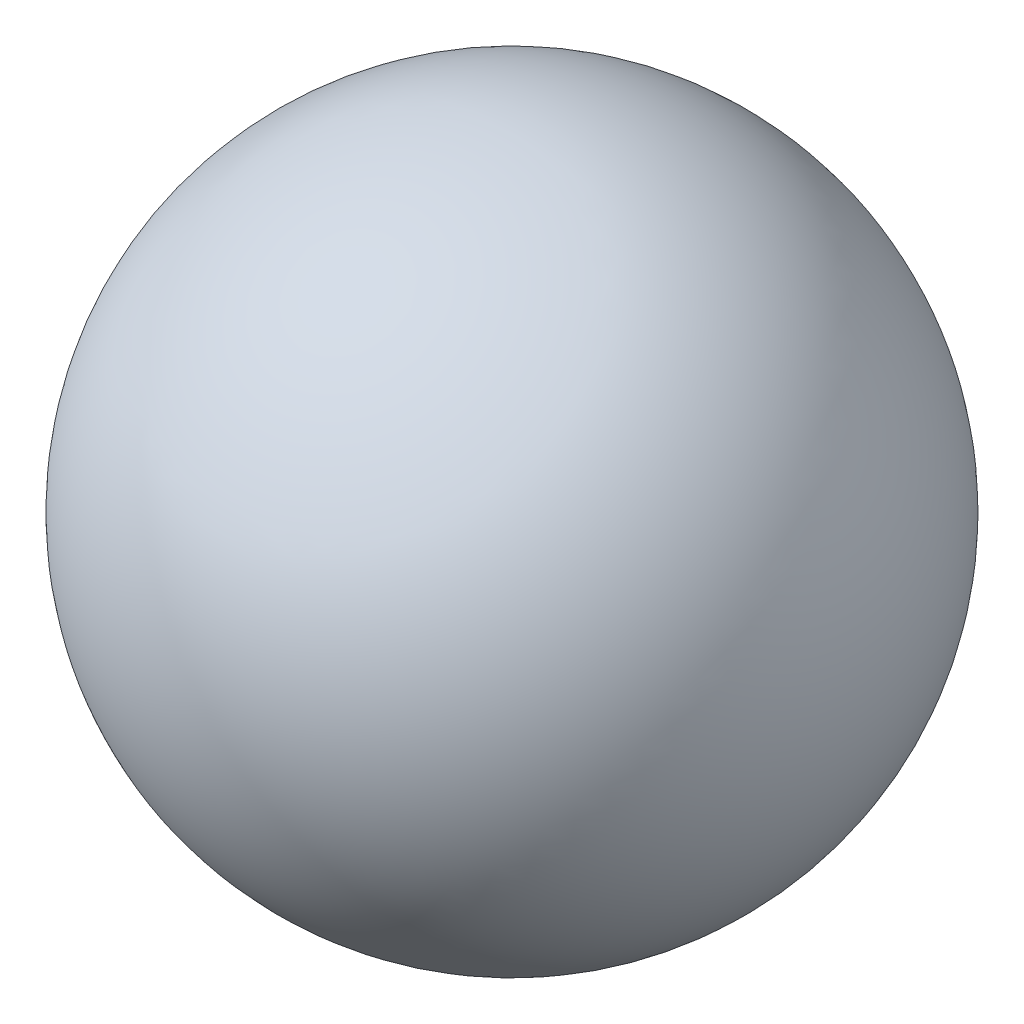
ISO-10303-21;
HEADER;
FILE_DESCRIPTION(('STEP AP214'),'2;1');
FILE_NAME('part.step','',(''),(''),'','','');
FILE_SCHEMA(('AUTOMOTIVE_DESIGN { 1 0 10303 214 1 1 1 1 }'));
ENDSEC;
DATA;
#1=APPLICATION_CONTEXT('core data for automotive mechanical design processes');
#2=APPLICATION_PROTOCOL_DEFINITION('international standard','automotive_design',2000,#1);
#3=PRODUCT_CONTEXT('',#1,'mechanical');
#4=PRODUCT('Part','Part','',(#3));
#5=PRODUCT_RELATED_PRODUCT_CATEGORY('part','',(#4));
#6=PRODUCT_DEFINITION_FORMATION('','',#4);
#7=PRODUCT_DEFINITION_CONTEXT('part definition',#1,'design');
#8=PRODUCT_DEFINITION('design','',#6,#7);
#9=PRODUCT_DEFINITION_SHAPE('','',#8);
#10=(LENGTH_UNIT() NAMED_UNIT(*) SI_UNIT(.MILLI.,.METRE.));
#11=(NAMED_UNIT(*) PLANE_ANGLE_UNIT() SI_UNIT($,.RADIAN.));
#12=(NAMED_UNIT(*) SI_UNIT($,.STERADIAN.) SOLID_ANGLE_UNIT());
#13=UNCERTAINTY_MEASURE_WITH_UNIT(LENGTH_MEASURE(1.E-05),#10,'distance_accuracy_value','');
#14=(GEOMETRIC_REPRESENTATION_CONTEXT(3) GLOBAL_UNCERTAINTY_ASSIGNED_CONTEXT((#13)) GLOBAL_UNIT_ASSIGNED_CONTEXT((#10,
#11,#12)) REPRESENTATION_CONTEXT('',''));
#15=CARTESIAN_POINT('',(0.,0.,0.));
#16=DIRECTION('',(0.,0.,1.));
#17=DIRECTION('',(1.,0.,0.));
#18=AXIS2_PLACEMENT_3D('',#15,#16,#17);
#19=CARTESIAN_POINT('',(0.,0.,-4.));
#20=DIRECTION('',(0.,0.,-1.));
#21=DIRECTION('',(-1.,0.,0.));
#22=AXIS2_PLACEMENT_3D('',#19,#20,#21);
#23=SPHERICAL_SURFACE('',#22,4.);
#24=CARTESIAN_POINT('',(0.,0.,-7.5));
#25=DIRECTION('',(0.,0.,-1.));
#26=DIRECTION('',(-1.,0.,0.));
#27=AXIS2_PLACEMENT_3D('',#24,#25,#26);
#28=CIRCLE('',#27,1.93649167310371);
#29=CARTESIAN_POINT('',(-1.93649167310371,0.,-7.5));
#30=VERTEX_POINT('',#29);
#31=EDGE_CURVE('E13',#30,#30,#28,.T.);
#32=ORIENTED_EDGE('',*,*,#31,.F.);
#33=EDGE_LOOP('',(#32));
#34=FACE_BOUND('',#33,.T.);
#35=ADVANCED_FACE('F54',(#34),#23,.T.);
#36=CARTESIAN_POINT('',(1.93649167310371,0.,-7.5));
#37=DIRECTION('',(0.,0.,1.));
#38=DIRECTION('',(1.,0.,0.));
#39=AXIS2_PLACEMENT_3D('',#36,#37,#38);
#40=PLANE('',#39);
#41=CARTESIAN_POINT('',(0.,0.,-7.5));
#42=DIRECTION('',(0.,0.,-1.));
#43=DIRECTION('',(-1.,0.,0.));
#44=AXIS2_PLACEMENT_3D('',#41,#42,#43);
#45=CIRCLE('',#44,1.24999999999999);
#46=CARTESIAN_POINT('',(-1.24999999999999,0.,-7.5));
#47=VERTEX_POINT('',#46);
#48=EDGE_CURVE('E72',#47,#47,#45,.T.);
#49=ORIENTED_EDGE('',*,*,#48,.F.);
#50=EDGE_LOOP('',(#49));
#51=FACE_BOUND('',#50,.T.);
#52=ORIENTED_EDGE('',*,*,#31,.T.);
#53=EDGE_LOOP('',(#52));
#54=FACE_BOUND('',#53,.T.);
#55=ADVANCED_FACE('F67',(#51,#54),#40,.F.);
#56=CARTESIAN_POINT('',(0.,0.,-2.5));
#57=DIRECTION('',(0.,0.,-1.));
#58=DIRECTION('',(-1.,0.,0.));
#59=AXIS2_PLACEMENT_3D('',#56,#57,#58);
#60=CONICAL_SURFACE('',#59,1.24999999999999,1.02974425867665);
#61=CARTESIAN_POINT('',(0.,0.,-1.74892422621555));
#62=VERTEX_POINT('',#61);
#63=VERTEX_LOOP('',#62);
#64=FACE_BOUND('',#63,.T.);
#65=CARTESIAN_POINT('',(0.,0.,-2.5));
#66=DIRECTION('',(0.,0.,-1.));
#67=DIRECTION('',(-1.,0.,0.));
#68=AXIS2_PLACEMENT_3D('',#65,#66,#67);
#69=CIRCLE('',#68,1.24999999999999);
#70=CARTESIAN_POINT('',(-1.24999999999999,0.,-2.5));
#71=VERTEX_POINT('',#70);
#72=EDGE_CURVE('E60',#71,#71,#69,.T.);
#73=ORIENTED_EDGE('',*,*,#72,.T.);
#74=EDGE_LOOP('',(#73));
#75=FACE_BOUND('',#74,.T.);
#76=ADVANCED_FACE('F63',(#64,#75),#60,.F.);
#77=CARTESIAN_POINT('',(0.,0.,-7.5));
#78=DIRECTION('',(0.,0.,-1.));
#79=DIRECTION('',(-1.,0.,0.));
#80=AXIS2_PLACEMENT_3D('',#77,#78,#79);
#81=CYLINDRICAL_SURFACE('',#80,1.24999999999999);
#82=ORIENTED_EDGE('',*,*,#72,.F.);
#83=EDGE_LOOP('',(#82));
#84=FACE_BOUND('',#83,.T.);
#85=ORIENTED_EDGE('',*,*,#48,.T.);
#86=EDGE_LOOP('',(#85));
#87=FACE_BOUND('',#86,.T.);
#88=ADVANCED_FACE('F66',(#84,#87),#81,.F.);
#89=CLOSED_SHELL('',(#35,#55,#76,#88));
#90=MANIFOLD_SOLID_BREP('B2',#89);
#91=ADVANCED_BREP_SHAPE_REPRESENTATION('',(#18,#90),#14);
#92=SHAPE_DEFINITION_REPRESENTATION(#9,#91);
ENDSEC;
END-ISO-10303-21;
